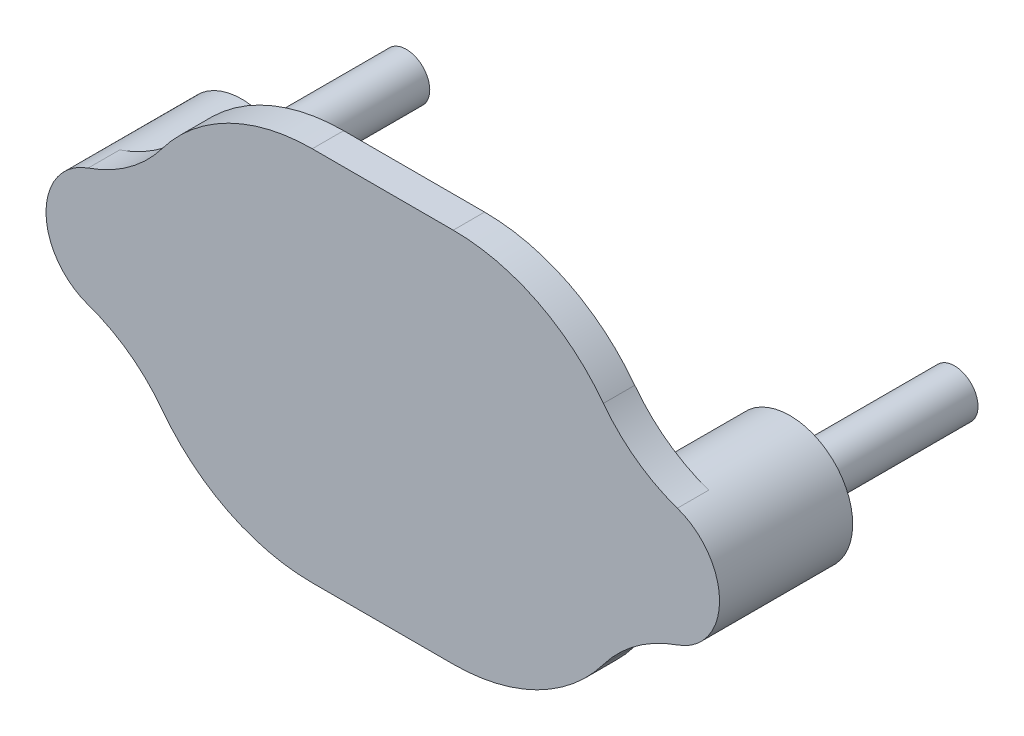
ISO-10303-21;
HEADER;
FILE_DESCRIPTION(('STEP AP214'),'2;1');
FILE_NAME('part.step','',(''),(''),'','','');
FILE_SCHEMA(('AUTOMOTIVE_DESIGN { 1 0 10303 214 1 1 1 1 }'));
ENDSEC;
DATA;
#1=APPLICATION_CONTEXT('core data for automotive mechanical design processes');
#2=APPLICATION_PROTOCOL_DEFINITION('international standard','automotive_design',2000,#1);
#3=PRODUCT_CONTEXT('',#1,'mechanical');
#4=PRODUCT('Part','Part','',(#3));
#5=PRODUCT_RELATED_PRODUCT_CATEGORY('part','',(#4));
#6=PRODUCT_DEFINITION_FORMATION('','',#4);
#7=PRODUCT_DEFINITION_CONTEXT('part definition',#1,'design');
#8=PRODUCT_DEFINITION('design','',#6,#7);
#9=PRODUCT_DEFINITION_SHAPE('','',#8);
#10=(LENGTH_UNIT() NAMED_UNIT(*) SI_UNIT(.MILLI.,.METRE.));
#11=(NAMED_UNIT(*) PLANE_ANGLE_UNIT() SI_UNIT($,.RADIAN.));
#12=(NAMED_UNIT(*) SI_UNIT($,.STERADIAN.) SOLID_ANGLE_UNIT());
#13=UNCERTAINTY_MEASURE_WITH_UNIT(LENGTH_MEASURE(1.E-05),#10,'distance_accuracy_value','');
#14=(GEOMETRIC_REPRESENTATION_CONTEXT(3) GLOBAL_UNCERTAINTY_ASSIGNED_CONTEXT((#13)) GLOBAL_UNIT_ASSIGNED_CONTEXT((#10,
#11,#12)) REPRESENTATION_CONTEXT('',''));
#15=CARTESIAN_POINT('',(0.,0.,0.));
#16=DIRECTION('',(0.,0.,1.));
#17=DIRECTION('',(1.,0.,0.));
#18=AXIS2_PLACEMENT_3D('',#15,#16,#17);
#19=CARTESIAN_POINT('',(4.5,0.,-2.));
#20=DIRECTION('',(0.,0.,1.));
#21=DIRECTION('',(1.,0.,0.));
#22=AXIS2_PLACEMENT_3D('',#19,#20,#21);
#23=CYLINDRICAL_SURFACE('',#22,12.);
#24=CARTESIAN_POINT('',(4.5,0.,0.));
#25=DIRECTION('',(0.,0.,-1.));
#26=DIRECTION('',(-1.,0.,0.));
#27=AXIS2_PLACEMENT_3D('',#24,#25,#26);
#28=CIRCLE('',#27,12.);
#29=CARTESIAN_POINT('',(4.5,12.,0.));
#30=VERTEX_POINT('',#29);
#31=CARTESIAN_POINT('',(14.0874125874126,7.21675272395575,0.));
#32=VERTEX_POINT('',#31);
#33=EDGE_CURVE('E165',#30,#32,#28,.T.);
#34=ORIENTED_EDGE('',*,*,#33,.T.);
#35=DIRECTION('',(0.,0.,1.));
#36=VECTOR('',#35,1.);
#37=CARTESIAN_POINT('',(14.0874125874126,7.21675272395575,-2.));
#38=LINE('',#37,#36);
#39=CARTESIAN_POINT('',(14.0874125874126,7.21675272395575,-2.));
#40=VERTEX_POINT('',#39);
#41=EDGE_CURVE('E236',#40,#32,#38,.T.);
#42=ORIENTED_EDGE('',*,*,#41,.F.);
#43=CARTESIAN_POINT('',(4.5,0.,-2.));
#44=DIRECTION('',(0.,0.,-1.));
#45=DIRECTION('',(-1.,0.,0.));
#46=AXIS2_PLACEMENT_3D('',#43,#44,#45);
#47=CIRCLE('',#46,12.);
#48=CARTESIAN_POINT('',(4.5,12.,-2.));
#49=VERTEX_POINT('',#48);
#50=EDGE_CURVE('E207',#49,#40,#47,.T.);
#51=ORIENTED_EDGE('',*,*,#50,.F.);
#52=DIRECTION('',(0.,0.,1.));
#53=VECTOR('',#52,1.);
#54=CARTESIAN_POINT('',(4.5,12.,-2.));
#55=LINE('',#54,#53);
#56=EDGE_CURVE('E161',#49,#30,#55,.T.);
#57=ORIENTED_EDGE('',*,*,#56,.T.);
#58=EDGE_LOOP('',(#34,#42,#51,#57));
#59=FACE_BOUND('',#58,.T.);
#60=ADVANCED_FACE('F39',(#59),#23,.T.);
#61=CARTESIAN_POINT('',(22.0769230769231,13.2307133272522,-2.));
#62=DIRECTION('',(0.,0.,1.));
#63=DIRECTION('',(1.,0.,0.));
#64=AXIS2_PLACEMENT_3D('',#61,#62,#63);
#65=CYLINDRICAL_SURFACE('',#64,10.);
#66=CARTESIAN_POINT('',(22.0769230769231,13.2307133272522,0.));
#67=DIRECTION('',(0.,0.,1.));
#68=DIRECTION('',(1.,0.,0.));
#69=AXIS2_PLACEMENT_3D('',#66,#67,#68);
#70=CIRCLE('',#69,10.);
#71=CARTESIAN_POINT('',(18.8076923076923,3.78020380778634,0.));
#72=VERTEX_POINT('',#71);
#73=EDGE_CURVE('E169',#32,#72,#70,.T.);
#74=ORIENTED_EDGE('',*,*,#73,.T.);
#75=DIRECTION('',(0.,0.,1.));
#76=VECTOR('',#75,1.);
#77=CARTESIAN_POINT('',(18.8076923076923,3.78020380778634,-2.));
#78=LINE('',#77,#76);
#79=CARTESIAN_POINT('',(18.8076923076923,3.78020380778634,-2.));
#80=VERTEX_POINT('',#79);
#81=EDGE_CURVE('E234',#80,#72,#78,.T.);
#82=ORIENTED_EDGE('',*,*,#81,.F.);
#83=CARTESIAN_POINT('',(22.0769230769231,13.2307133272522,-2.));
#84=DIRECTION('',(0.,0.,1.));
#85=DIRECTION('',(1.,0.,0.));
#86=AXIS2_PLACEMENT_3D('',#83,#84,#85);
#87=CIRCLE('',#86,10.);
#88=EDGE_CURVE('E111',#40,#80,#87,.T.);
#89=ORIENTED_EDGE('',*,*,#88,.F.);
#90=ORIENTED_EDGE('',*,*,#41,.T.);
#91=EDGE_LOOP('',(#74,#82,#89,#90));
#92=FACE_BOUND('',#91,.T.);
#93=ADVANCED_FACE('F297',(#92),#65,.F.);
#94=CARTESIAN_POINT('',(17.5,0.,-2.));
#95=DIRECTION('',(0.,0.,1.));
#96=DIRECTION('',(1.,0.,0.));
#97=AXIS2_PLACEMENT_3D('',#94,#95,#96);
#98=CYLINDRICAL_SURFACE('',#97,4.);
#99=CARTESIAN_POINT('',(17.5,0.,0.));
#100=DIRECTION('',(0.,0.,1.));
#101=DIRECTION('',(1.,0.,0.));
#102=AXIS2_PLACEMENT_3D('',#99,#100,#101);
#103=CIRCLE('',#102,4.);
#104=CARTESIAN_POINT('',(18.8076923076923,-3.78020380778634,0.));
#105=VERTEX_POINT('',#104);
#106=EDGE_CURVE('E174',#105,#72,#103,.T.);
#107=ORIENTED_EDGE('',*,*,#106,.F.);
#108=DIRECTION('',(0.,0.,1.));
#109=VECTOR('',#108,1.);
#110=CARTESIAN_POINT('',(18.8076923076923,-3.78020380778634,-2.));
#111=LINE('',#110,#109);
#112=CARTESIAN_POINT('',(18.8076923076923,-3.78020380778634,-2.));
#113=VERTEX_POINT('',#112);
#114=EDGE_CURVE('E231',#113,#105,#111,.T.);
#115=ORIENTED_EDGE('',*,*,#114,.F.);
#116=CARTESIAN_POINT('',(17.5,0.,-2.));
#117=DIRECTION('',(0.,0.,-1.));
#118=DIRECTION('',(-1.,0.,0.));
#119=AXIS2_PLACEMENT_3D('',#116,#117,#118);
#120=CIRCLE('',#119,4.);
#121=EDGE_CURVE('E42',#80,#113,#120,.F.);
#122=ORIENTED_EDGE('',*,*,#121,.F.);
#123=ORIENTED_EDGE('',*,*,#81,.T.);
#124=EDGE_LOOP('',(#107,#115,#122,#123));
#125=FACE_BOUND('',#124,.T.);
#126=CARTESIAN_POINT('',(17.5,0.,-8.5));
#127=DIRECTION('',(0.,0.,-1.));
#128=DIRECTION('',(-1.,0.,0.));
#129=AXIS2_PLACEMENT_3D('',#126,#127,#128);
#130=CIRCLE('',#129,4.);
#131=CARTESIAN_POINT('',(13.5,0.,-8.5));
#132=VERTEX_POINT('',#131);
#133=EDGE_CURVE('E251',#132,#132,#130,.T.);
#134=ORIENTED_EDGE('',*,*,#133,.F.);
#135=EDGE_LOOP('',(#134));
#136=FACE_BOUND('',#135,.T.);
#137=ADVANCED_FACE('F294',(#125,#136),#98,.T.);
#138=CARTESIAN_POINT('',(22.0769230769231,-13.2307133272522,-2.));
#139=DIRECTION('',(0.,0.,1.));
#140=DIRECTION('',(1.,0.,0.));
#141=AXIS2_PLACEMENT_3D('',#138,#139,#140);
#142=CYLINDRICAL_SURFACE('',#141,10.);
#143=CARTESIAN_POINT('',(22.0769230769231,-13.2307133272522,0.));
#144=DIRECTION('',(0.,0.,-1.));
#145=DIRECTION('',(-1.,0.,0.));
#146=AXIS2_PLACEMENT_3D('',#143,#144,#145);
#147=CIRCLE('',#146,10.);
#148=CARTESIAN_POINT('',(14.0874125874126,-7.21675272395575,0.));
#149=VERTEX_POINT('',#148);
#150=EDGE_CURVE('E178',#149,#105,#147,.T.);
#151=ORIENTED_EDGE('',*,*,#150,.F.);
#152=DIRECTION('',(0.,0.,1.));
#153=VECTOR('',#152,1.);
#154=CARTESIAN_POINT('',(14.0874125874126,-7.21675272395575,-2.));
#155=LINE('',#154,#153);
#156=CARTESIAN_POINT('',(14.0874125874126,-7.21675272395575,-2.));
#157=VERTEX_POINT('',#156);
#158=EDGE_CURVE('E228',#157,#149,#155,.T.);
#159=ORIENTED_EDGE('',*,*,#158,.F.);
#160=CARTESIAN_POINT('',(22.0769230769231,-13.2307133272522,-2.));
#161=DIRECTION('',(0.,0.,-1.));
#162=DIRECTION('',(-1.,0.,0.));
#163=AXIS2_PLACEMENT_3D('',#160,#161,#162);
#164=CIRCLE('',#163,10.);
#165=EDGE_CURVE('E264',#157,#113,#164,.T.);
#166=ORIENTED_EDGE('',*,*,#165,.T.);
#167=ORIENTED_EDGE('',*,*,#114,.T.);
#168=EDGE_LOOP('',(#151,#159,#166,#167));
#169=FACE_BOUND('',#168,.T.);
#170=ADVANCED_FACE('F304',(#169),#142,.F.);
#171=CARTESIAN_POINT('',(4.5,0.,-2.));
#172=DIRECTION('',(0.,0.,1.));
#173=DIRECTION('',(1.,0.,0.));
#174=AXIS2_PLACEMENT_3D('',#171,#172,#173);
#175=CYLINDRICAL_SURFACE('',#174,12.);
#176=CARTESIAN_POINT('',(4.5,0.,0.));
#177=DIRECTION('',(0.,0.,1.));
#178=DIRECTION('',(1.,0.,0.));
#179=AXIS2_PLACEMENT_3D('',#176,#177,#178);
#180=CIRCLE('',#179,12.);
#181=CARTESIAN_POINT('',(4.5,-12.,0.));
#182=VERTEX_POINT('',#181);
#183=EDGE_CURVE('E182',#182,#149,#180,.T.);
#184=ORIENTED_EDGE('',*,*,#183,.F.);
#185=DIRECTION('',(0.,0.,1.));
#186=VECTOR('',#185,1.);
#187=CARTESIAN_POINT('',(4.5,-12.,-2.));
#188=LINE('',#187,#186);
#189=CARTESIAN_POINT('',(4.5,-12.,-2.));
#190=VERTEX_POINT('',#189);
#191=EDGE_CURVE('E225',#190,#182,#188,.T.);
#192=ORIENTED_EDGE('',*,*,#191,.F.);
#193=CARTESIAN_POINT('',(4.5,0.,-2.));
#194=DIRECTION('',(0.,0.,1.));
#195=DIRECTION('',(1.,0.,0.));
#196=AXIS2_PLACEMENT_3D('',#193,#194,#195);
#197=CIRCLE('',#196,12.);
#198=EDGE_CURVE('E268',#190,#157,#197,.T.);
#199=ORIENTED_EDGE('',*,*,#198,.T.);
#200=ORIENTED_EDGE('',*,*,#158,.T.);
#201=EDGE_LOOP('',(#184,#192,#199,#200));
#202=FACE_BOUND('',#201,.T.);
#203=ADVANCED_FACE('F307',(#202),#175,.T.);
#204=CARTESIAN_POINT('',(-4.5,-12.,-2.));
#205=DIRECTION('',(0.,-1.,0.));
#206=DIRECTION('',(0.,0.,-1.));
#207=AXIS2_PLACEMENT_3D('',#204,#205,#206);
#208=PLANE('',#207);
#209=DIRECTION('',(1.,0.,0.));
#210=VECTOR('',#209,1.);
#211=CARTESIAN_POINT('',(-4.5,-12.,0.));
#212=LINE('',#211,#210);
#213=CARTESIAN_POINT('',(-4.5,-12.,0.));
#214=VERTEX_POINT('',#213);
#215=EDGE_CURVE('E186',#214,#182,#212,.T.);
#216=ORIENTED_EDGE('',*,*,#215,.F.);
#217=DIRECTION('',(0.,0.,1.));
#218=VECTOR('',#217,1.);
#219=CARTESIAN_POINT('',(-4.5,-12.,-2.));
#220=LINE('',#219,#218);
#221=CARTESIAN_POINT('',(-4.5,-12.,-2.));
#222=VERTEX_POINT('',#221);
#223=EDGE_CURVE('E222',#222,#214,#220,.T.);
#224=ORIENTED_EDGE('',*,*,#223,.F.);
#225=DIRECTION('',(1.,0.,0.));
#226=VECTOR('',#225,1.);
#227=CARTESIAN_POINT('',(-4.5,-12.,-2.));
#228=LINE('',#227,#226);
#229=EDGE_CURVE('E272',#222,#190,#228,.T.);
#230=ORIENTED_EDGE('',*,*,#229,.T.);
#231=ORIENTED_EDGE('',*,*,#191,.T.);
#232=EDGE_LOOP('',(#216,#224,#230,#231));
#233=FACE_BOUND('',#232,.T.);
#234=ADVANCED_FACE('F310',(#233),#208,.T.);
#235=CARTESIAN_POINT('',(-4.5,0.,-2.));
#236=DIRECTION('',(0.,0.,1.));
#237=DIRECTION('',(1.,0.,0.));
#238=AXIS2_PLACEMENT_3D('',#235,#236,#237);
#239=CYLINDRICAL_SURFACE('',#238,12.);
#240=CARTESIAN_POINT('',(-4.5,0.,0.));
#241=DIRECTION('',(0.,0.,-1.));
#242=DIRECTION('',(-1.,0.,0.));
#243=AXIS2_PLACEMENT_3D('',#240,#241,#242);
#244=CIRCLE('',#243,12.);
#245=CARTESIAN_POINT('',(-14.0874125874126,-7.21675272395575,0.));
#246=VERTEX_POINT('',#245);
#247=EDGE_CURVE('E190',#214,#246,#244,.T.);
#248=ORIENTED_EDGE('',*,*,#247,.T.);
#249=DIRECTION('',(0.,0.,1.));
#250=VECTOR('',#249,1.);
#251=CARTESIAN_POINT('',(-14.0874125874126,-7.21675272395575,-2.));
#252=LINE('',#251,#250);
#253=CARTESIAN_POINT('',(-14.0874125874126,-7.21675272395575,-2.));
#254=VERTEX_POINT('',#253);
#255=EDGE_CURVE('E218',#254,#246,#252,.T.);
#256=ORIENTED_EDGE('',*,*,#255,.F.);
#257=CARTESIAN_POINT('',(-4.5,0.,-2.));
#258=DIRECTION('',(0.,0.,-1.));
#259=DIRECTION('',(-1.,0.,0.));
#260=AXIS2_PLACEMENT_3D('',#257,#258,#259);
#261=CIRCLE('',#260,12.);
#262=EDGE_CURVE('E276',#222,#254,#261,.T.);
#263=ORIENTED_EDGE('',*,*,#262,.F.);
#264=ORIENTED_EDGE('',*,*,#223,.T.);
#265=EDGE_LOOP('',(#248,#256,#263,#264));
#266=FACE_BOUND('',#265,.T.);
#267=ADVANCED_FACE('F313',(#266),#239,.T.);
#268=CARTESIAN_POINT('',(-22.0769230769231,-13.2307133272522,-2.));
#269=DIRECTION('',(0.,0.,1.));
#270=DIRECTION('',(1.,0.,0.));
#271=AXIS2_PLACEMENT_3D('',#268,#269,#270);
#272=CYLINDRICAL_SURFACE('',#271,10.);
#273=CARTESIAN_POINT('',(-22.0769230769231,-13.2307133272522,0.));
#274=DIRECTION('',(0.,0.,1.));
#275=DIRECTION('',(1.,0.,0.));
#276=AXIS2_PLACEMENT_3D('',#273,#274,#275);
#277=CIRCLE('',#276,10.);
#278=CARTESIAN_POINT('',(-18.8076923076923,-3.78020380778635,0.));
#279=VERTEX_POINT('',#278);
#280=EDGE_CURVE('E193',#246,#279,#277,.T.);
#281=ORIENTED_EDGE('',*,*,#280,.T.);
#282=DIRECTION('',(0.,0.,1.));
#283=VECTOR('',#282,1.);
#284=CARTESIAN_POINT('',(-18.8076923076923,-3.78020380778635,-2.));
#285=LINE('',#284,#283);
#286=CARTESIAN_POINT('',(-18.8076923076923,-3.78020380778635,-2.));
#287=VERTEX_POINT('',#286);
#288=EDGE_CURVE('E214',#287,#279,#285,.T.);
#289=ORIENTED_EDGE('',*,*,#288,.F.);
#290=CARTESIAN_POINT('',(-22.0769230769231,-13.2307133272522,-2.));
#291=DIRECTION('',(0.,0.,1.));
#292=DIRECTION('',(1.,0.,0.));
#293=AXIS2_PLACEMENT_3D('',#290,#291,#292);
#294=CIRCLE('',#293,10.);
#295=EDGE_CURVE('E155',#254,#287,#294,.T.);
#296=ORIENTED_EDGE('',*,*,#295,.F.);
#297=ORIENTED_EDGE('',*,*,#255,.T.);
#298=EDGE_LOOP('',(#281,#289,#296,#297));
#299=FACE_BOUND('',#298,.T.);
#300=ADVANCED_FACE('F285',(#299),#272,.F.);
#301=CARTESIAN_POINT('',(-17.5,0.,-2.));
#302=DIRECTION('',(0.,0.,1.));
#303=DIRECTION('',(1.,0.,0.));
#304=AXIS2_PLACEMENT_3D('',#301,#302,#303);
#305=CYLINDRICAL_SURFACE('',#304,4.);
#306=CARTESIAN_POINT('',(-17.5,0.,0.));
#307=DIRECTION('',(0.,0.,-1.));
#308=DIRECTION('',(-1.,0.,0.));
#309=AXIS2_PLACEMENT_3D('',#306,#307,#308);
#310=CIRCLE('',#309,4.);
#311=CARTESIAN_POINT('',(-18.8076923076923,3.78020380778634,0.));
#312=VERTEX_POINT('',#311);
#313=EDGE_CURVE('E196',#279,#312,#310,.T.);
#314=ORIENTED_EDGE('',*,*,#313,.T.);
#315=DIRECTION('',(0.,0.,1.));
#316=VECTOR('',#315,1.);
#317=CARTESIAN_POINT('',(-18.8076923076923,3.78020380778634,-2.));
#318=LINE('',#317,#316);
#319=CARTESIAN_POINT('',(-18.8076923076923,3.78020380778634,-2.));
#320=VERTEX_POINT('',#319);
#321=EDGE_CURVE('E147',#320,#312,#318,.T.);
#322=ORIENTED_EDGE('',*,*,#321,.F.);
#323=CARTESIAN_POINT('',(-17.5,0.,-2.));
#324=DIRECTION('',(0.,0.,-1.));
#325=DIRECTION('',(-1.,0.,0.));
#326=AXIS2_PLACEMENT_3D('',#323,#324,#325);
#327=CIRCLE('',#326,4.);
#328=EDGE_CURVE('E153',#320,#287,#327,.T.);
#329=ORIENTED_EDGE('',*,*,#328,.T.);
#330=ORIENTED_EDGE('',*,*,#288,.T.);
#331=EDGE_LOOP('',(#314,#322,#329,#330));
#332=FACE_BOUND('',#331,.T.);
#333=CARTESIAN_POINT('',(-17.5,0.,-8.5));
#334=DIRECTION('',(0.,0.,-1.));
#335=DIRECTION('',(-1.,0.,0.));
#336=AXIS2_PLACEMENT_3D('',#333,#334,#335);
#337=CIRCLE('',#336,4.);
#338=CARTESIAN_POINT('',(-21.5,0.,-8.5));
#339=VERTEX_POINT('',#338);
#340=EDGE_CURVE('E170',#339,#339,#337,.T.);
#341=ORIENTED_EDGE('',*,*,#340,.F.);
#342=EDGE_LOOP('',(#341));
#343=FACE_BOUND('',#342,.T.);
#344=ADVANCED_FACE('F289',(#332,#343),#305,.T.);
#345=CARTESIAN_POINT('',(-22.0769230769231,13.2307133272522,-2.));
#346=DIRECTION('',(0.,0.,1.));
#347=DIRECTION('',(1.,0.,0.));
#348=AXIS2_PLACEMENT_3D('',#345,#346,#347);
#349=CYLINDRICAL_SURFACE('',#348,10.);
#350=CARTESIAN_POINT('',(-22.0769230769231,13.2307133272522,0.));
#351=DIRECTION('',(0.,0.,-1.));
#352=DIRECTION('',(-1.,0.,0.));
#353=AXIS2_PLACEMENT_3D('',#350,#351,#352);
#354=CIRCLE('',#353,10.);
#355=CARTESIAN_POINT('',(-14.0874125874126,7.21675272395575,0.));
#356=VERTEX_POINT('',#355);
#357=EDGE_CURVE('E141',#356,#312,#354,.T.);
#358=ORIENTED_EDGE('',*,*,#357,.F.);
#359=DIRECTION('',(0.,0.,1.));
#360=VECTOR('',#359,1.);
#361=CARTESIAN_POINT('',(-14.0874125874126,7.21675272395575,-2.));
#362=LINE('',#361,#360);
#363=CARTESIAN_POINT('',(-14.0874125874126,7.21675272395575,-2.));
#364=VERTEX_POINT('',#363);
#365=EDGE_CURVE('E135',#364,#356,#362,.T.);
#366=ORIENTED_EDGE('',*,*,#365,.F.);
#367=CARTESIAN_POINT('',(-22.0769230769231,13.2307133272522,-2.));
#368=DIRECTION('',(0.,0.,-1.));
#369=DIRECTION('',(-1.,0.,0.));
#370=AXIS2_PLACEMENT_3D('',#367,#368,#369);
#371=CIRCLE('',#370,10.);
#372=EDGE_CURVE('E138',#364,#320,#371,.T.);
#373=ORIENTED_EDGE('',*,*,#372,.T.);
#374=ORIENTED_EDGE('',*,*,#321,.T.);
#375=EDGE_LOOP('',(#358,#366,#373,#374));
#376=FACE_BOUND('',#375,.T.);
#377=ADVANCED_FACE('F137',(#376),#349,.F.);
#378=CARTESIAN_POINT('',(-4.5,0.,-2.));
#379=DIRECTION('',(0.,0.,1.));
#380=DIRECTION('',(1.,0.,0.));
#381=AXIS2_PLACEMENT_3D('',#378,#379,#380);
#382=CYLINDRICAL_SURFACE('',#381,12.);
#383=CARTESIAN_POINT('',(-4.5,0.,0.));
#384=DIRECTION('',(0.,0.,1.));
#385=DIRECTION('',(1.,0.,0.));
#386=AXIS2_PLACEMENT_3D('',#383,#384,#385);
#387=CIRCLE('',#386,12.);
#388=CARTESIAN_POINT('',(-4.5,12.,0.));
#389=VERTEX_POINT('',#388);
#390=EDGE_CURVE('E202',#389,#356,#387,.T.);
#391=ORIENTED_EDGE('',*,*,#390,.F.);
#392=DIRECTION('',(0.,0.,1.));
#393=VECTOR('',#392,1.);
#394=CARTESIAN_POINT('',(-4.5,12.,-2.));
#395=LINE('',#394,#393);
#396=CARTESIAN_POINT('',(-4.5,12.,-2.));
#397=VERTEX_POINT('',#396);
#398=EDGE_CURVE('E99',#397,#389,#395,.T.);
#399=ORIENTED_EDGE('',*,*,#398,.F.);
#400=CARTESIAN_POINT('',(-4.5,0.,-2.));
#401=DIRECTION('',(0.,0.,1.));
#402=DIRECTION('',(1.,0.,0.));
#403=AXIS2_PLACEMENT_3D('',#400,#401,#402);
#404=CIRCLE('',#403,12.);
#405=EDGE_CURVE('E151',#397,#364,#404,.T.);
#406=ORIENTED_EDGE('',*,*,#405,.T.);
#407=ORIENTED_EDGE('',*,*,#365,.T.);
#408=EDGE_LOOP('',(#391,#399,#406,#407));
#409=FACE_BOUND('',#408,.T.);
#410=ADVANCED_FACE('F157',(#409),#382,.T.);
#411=CARTESIAN_POINT('',(-4.5,12.,-2.));
#412=DIRECTION('',(0.,-1.,0.));
#413=DIRECTION('',(0.,0.,-1.));
#414=AXIS2_PLACEMENT_3D('',#411,#412,#413);
#415=PLANE('',#414);
#416=DIRECTION('',(1.,0.,0.));
#417=VECTOR('',#416,1.);
#418=CARTESIAN_POINT('',(-4.5,12.,0.));
#419=LINE('',#418,#417);
#420=EDGE_CURVE('E102',#389,#30,#419,.T.);
#421=ORIENTED_EDGE('',*,*,#420,.T.);
#422=ORIENTED_EDGE('',*,*,#56,.F.);
#423=DIRECTION('',(1.,0.,0.));
#424=VECTOR('',#423,1.);
#425=CARTESIAN_POINT('',(-4.5,12.,-2.));
#426=LINE('',#425,#424);
#427=EDGE_CURVE('E58',#397,#49,#426,.T.);
#428=ORIENTED_EDGE('',*,*,#427,.F.);
#429=ORIENTED_EDGE('',*,*,#398,.T.);
#430=EDGE_LOOP('',(#421,#422,#428,#429));
#431=FACE_BOUND('',#430,.T.);
#432=ADVANCED_FACE('F315',(#431),#415,.F.);
#433=CARTESIAN_POINT('',(4.5,0.,-2.));
#434=DIRECTION('',(0.,0.,-1.));
#435=DIRECTION('',(-1.,0.,0.));
#436=AXIS2_PLACEMENT_3D('',#433,#434,#435);
#437=PLANE('',#436);
#438=ORIENTED_EDGE('',*,*,#88,.T.);
#439=ORIENTED_EDGE('',*,*,#121,.T.);
#440=ORIENTED_EDGE('',*,*,#165,.F.);
#441=ORIENTED_EDGE('',*,*,#198,.F.);
#442=ORIENTED_EDGE('',*,*,#229,.F.);
#443=ORIENTED_EDGE('',*,*,#262,.T.);
#444=ORIENTED_EDGE('',*,*,#295,.T.);
#445=ORIENTED_EDGE('',*,*,#328,.F.);
#446=ORIENTED_EDGE('',*,*,#372,.F.);
#447=ORIENTED_EDGE('',*,*,#405,.F.);
#448=ORIENTED_EDGE('',*,*,#427,.T.);
#449=ORIENTED_EDGE('',*,*,#50,.T.);
#450=EDGE_LOOP('',(#438,#439,#440,#441,#442,#443,#444,#445,#446,#447,#448,#449));
#451=FACE_BOUND('',#450,.T.);
#452=ADVANCED_FACE('F150',(#451),#437,.T.);
#453=CARTESIAN_POINT('',(4.5,0.,0.));
#454=DIRECTION('',(0.,0.,-1.));
#455=DIRECTION('',(-1.,0.,0.));
#456=AXIS2_PLACEMENT_3D('',#453,#454,#455);
#457=PLANE('',#456);
#458=ORIENTED_EDGE('',*,*,#33,.F.);
#459=ORIENTED_EDGE('',*,*,#420,.F.);
#460=ORIENTED_EDGE('',*,*,#390,.T.);
#461=ORIENTED_EDGE('',*,*,#357,.T.);
#462=ORIENTED_EDGE('',*,*,#313,.F.);
#463=ORIENTED_EDGE('',*,*,#280,.F.);
#464=ORIENTED_EDGE('',*,*,#247,.F.);
#465=ORIENTED_EDGE('',*,*,#215,.T.);
#466=ORIENTED_EDGE('',*,*,#183,.T.);
#467=ORIENTED_EDGE('',*,*,#150,.T.);
#468=ORIENTED_EDGE('',*,*,#106,.T.);
#469=ORIENTED_EDGE('',*,*,#73,.F.);
#470=EDGE_LOOP('',(#458,#459,#460,#461,#462,#463,#464,#465,#466,#467,#468,#469));
#471=FACE_BOUND('',#470,.T.);
#472=ADVANCED_FACE('F300',(#471),#457,.F.);
#473=CARTESIAN_POINT('',(-17.5,0.,-8.5));
#474=DIRECTION('',(0.,0.,-1.));
#475=DIRECTION('',(-1.,0.,0.));
#476=AXIS2_PLACEMENT_3D('',#473,#474,#475);
#477=PLANE('',#476);
#478=CARTESIAN_POINT('',(-17.5,0.,-8.5));
#479=DIRECTION('',(0.,0.,-1.));
#480=DIRECTION('',(-1.,0.,0.));
#481=AXIS2_PLACEMENT_3D('',#478,#479,#480);
#482=CIRCLE('',#481,1.5);
#483=CARTESIAN_POINT('',(-16.,0.,-8.5));
#484=VERTEX_POINT('',#483);
#485=EDGE_CURVE('E49',#484,#484,#482,.T.);
#486=ORIENTED_EDGE('',*,*,#485,.F.);
#487=EDGE_LOOP('',(#486));
#488=FACE_BOUND('',#487,.T.);
#489=ORIENTED_EDGE('',*,*,#340,.T.);
#490=EDGE_LOOP('',(#489));
#491=FACE_BOUND('',#490,.T.);
#492=ADVANCED_FACE('F369',(#488,#491),#477,.T.);
#493=CARTESIAN_POINT('',(17.5,0.,-8.5));
#494=DIRECTION('',(0.,0.,-1.));
#495=DIRECTION('',(-1.,0.,0.));
#496=AXIS2_PLACEMENT_3D('',#493,#494,#495);
#497=PLANE('',#496);
#498=CARTESIAN_POINT('',(17.5,0.,-8.5));
#499=DIRECTION('',(0.,0.,-1.));
#500=DIRECTION('',(-1.,0.,0.));
#501=AXIS2_PLACEMENT_3D('',#498,#499,#500);
#502=CIRCLE('',#501,1.5);
#503=CARTESIAN_POINT('',(19.,0.,-8.5));
#504=VERTEX_POINT('',#503);
#505=EDGE_CURVE('E11',#504,#504,#502,.T.);
#506=ORIENTED_EDGE('',*,*,#505,.F.);
#507=EDGE_LOOP('',(#506));
#508=FACE_BOUND('',#507,.T.);
#509=ORIENTED_EDGE('',*,*,#133,.T.);
#510=EDGE_LOOP('',(#509));
#511=FACE_BOUND('',#510,.T.);
#512=ADVANCED_FACE('F414',(#508,#511),#497,.T.);
#513=CARTESIAN_POINT('',(-17.5,0.,-19.));
#514=DIRECTION('',(0.,0.,1.));
#515=DIRECTION('',(1.,0.,0.));
#516=AXIS2_PLACEMENT_3D('',#513,#514,#515);
#517=CYLINDRICAL_SURFACE('',#516,1.5);
#518=CARTESIAN_POINT('',(-17.5,0.,-19.));
#519=DIRECTION('',(0.,0.,-1.));
#520=DIRECTION('',(-1.,0.,0.));
#521=AXIS2_PLACEMENT_3D('',#518,#519,#520);
#522=CIRCLE('',#521,1.5);
#523=CARTESIAN_POINT('',(-16.,0.,-19.));
#524=VERTEX_POINT('',#523);
#525=EDGE_CURVE('E250',#524,#524,#522,.T.);
#526=CARTESIAN_POINT('',(-16.,0.,-19.));
#527=CARTESIAN_POINT('',(-16.,0.,-18.890625));
#528=CARTESIAN_POINT('',(-16.,0.,-18.78125));
#529=CARTESIAN_POINT('',(-16.,0.,-18.5625));
#530=CARTESIAN_POINT('',(-16.,0.,-18.453125));
#531=CARTESIAN_POINT('',(-16.,0.,-18.234375));
#532=CARTESIAN_POINT('',(-16.,0.,-18.125));
#533=CARTESIAN_POINT('',(-16.,0.,-17.90625));
#534=CARTESIAN_POINT('',(-16.,0.,-17.796875));
#535=CARTESIAN_POINT('',(-16.,0.,-17.578125));
#536=CARTESIAN_POINT('',(-16.,0.,-17.46875));
#537=CARTESIAN_POINT('',(-16.,0.,-17.25));
#538=CARTESIAN_POINT('',(-16.,0.,-17.140625));
#539=CARTESIAN_POINT('',(-16.,0.,-16.921875));
#540=CARTESIAN_POINT('',(-16.,0.,-16.8125));
#541=CARTESIAN_POINT('',(-16.,0.,-16.59375));
#542=CARTESIAN_POINT('',(-16.,0.,-16.484375));
#543=CARTESIAN_POINT('',(-16.,0.,-16.265625));
#544=CARTESIAN_POINT('',(-16.,0.,-16.15625));
#545=CARTESIAN_POINT('',(-16.,0.,-15.9375));
#546=CARTESIAN_POINT('',(-16.,0.,-15.828125));
#547=CARTESIAN_POINT('',(-16.,0.,-15.609375));
#548=CARTESIAN_POINT('',(-16.,0.,-15.5));
#549=CARTESIAN_POINT('',(-16.,0.,-15.28125));
#550=CARTESIAN_POINT('',(-16.,0.,-15.171875));
#551=CARTESIAN_POINT('',(-16.,0.,-14.953125));
#552=CARTESIAN_POINT('',(-16.,0.,-14.84375));
#553=CARTESIAN_POINT('',(-16.,0.,-14.625));
#554=CARTESIAN_POINT('',(-16.,0.,-14.515625));
#555=CARTESIAN_POINT('',(-16.,0.,-14.296875));
#556=CARTESIAN_POINT('',(-16.,0.,-14.1875));
#557=CARTESIAN_POINT('',(-16.,0.,-13.96875));
#558=CARTESIAN_POINT('',(-16.,0.,-13.859375));
#559=CARTESIAN_POINT('',(-16.,0.,-13.640625));
#560=CARTESIAN_POINT('',(-16.,0.,-13.53125));
#561=CARTESIAN_POINT('',(-16.,0.,-13.3125));
#562=CARTESIAN_POINT('',(-16.,0.,-13.203125));
#563=CARTESIAN_POINT('',(-16.,0.,-12.984375));
#564=CARTESIAN_POINT('',(-16.,0.,-12.875));
#565=CARTESIAN_POINT('',(-16.,0.,-12.65625));
#566=CARTESIAN_POINT('',(-16.,0.,-12.546875));
#567=CARTESIAN_POINT('',(-16.,0.,-12.328125));
#568=CARTESIAN_POINT('',(-16.,0.,-12.21875));
#569=CARTESIAN_POINT('',(-16.,0.,-12.));
#570=CARTESIAN_POINT('',(-16.,0.,-11.890625));
#571=CARTESIAN_POINT('',(-16.,0.,-11.671875));
#572=CARTESIAN_POINT('',(-16.,0.,-11.5625));
#573=CARTESIAN_POINT('',(-16.,0.,-11.34375));
#574=CARTESIAN_POINT('',(-16.,0.,-11.234375));
#575=CARTESIAN_POINT('',(-16.,0.,-11.015625));
#576=CARTESIAN_POINT('',(-16.,0.,-10.90625));
#577=CARTESIAN_POINT('',(-16.,0.,-10.6875));
#578=CARTESIAN_POINT('',(-16.,0.,-10.578125));
#579=CARTESIAN_POINT('',(-16.,0.,-10.359375));
#580=CARTESIAN_POINT('',(-16.,0.,-10.25));
#581=CARTESIAN_POINT('',(-16.,0.,-10.03125));
#582=CARTESIAN_POINT('',(-16.,0.,-9.921875));
#583=CARTESIAN_POINT('',(-16.,0.,-9.703125));
#584=CARTESIAN_POINT('',(-16.,0.,-9.59375));
#585=CARTESIAN_POINT('',(-16.,0.,-9.375));
#586=CARTESIAN_POINT('',(-16.,0.,-9.265625));
#587=CARTESIAN_POINT('',(-16.,0.,-9.046875));
#588=CARTESIAN_POINT('',(-16.,0.,-8.9375));
#589=CARTESIAN_POINT('',(-16.,0.,-8.71875));
#590=CARTESIAN_POINT('',(-16.,0.,-8.609375));
#591=CARTESIAN_POINT('',(-16.,0.,-8.5));
#592=B_SPLINE_CURVE_WITH_KNOTS('',3,(#526,#527,#528,#529,#530,#531,#532,#533,#534,#535,#536,
#537,#538,#539,#540,#541,#542,#543,#544,#545,#546,#547,#548,#549,#550,#551,#552,#553,#554,#555,
#556,#557,#558,#559,#560,#561,#562,#563,#564,#565,#566,#567,#568,#569,#570,#571,#572,#573,#574,
#575,#576,#577,#578,#579,#580,#581,#582,#583,#584,#585,#586,#587,#588,#589,#590,#591),
.UNSPECIFIED.,.F.,.F.,(4,2,2,2,2,2,2,2,2,2,2,2,2,2,2,2,2,2,2,2,2,2,2,2,2,2,2,2,2,2,2,2,4),(0.,
0.328125000000002,0.656250000000001,0.984375000000003,1.3125,1.640625,1.96875,2.296875,2.625,
2.953125,3.28125,3.609375,3.9375,4.265625,4.59375,4.921875,5.25,5.578125,5.90625,6.234375,
6.5625,6.890625,7.21875,7.54687500000001,7.875,8.203125,8.53125,8.859375,9.1875,9.515625,
9.84375,10.171875,10.5),.UNSPECIFIED.);
#593=EDGE_CURVE('BSEAM424',#524,#484,#592,.T.);
#594=ORIENTED_EDGE('',*,*,#525,.F.);
#595=ORIENTED_EDGE('',*,*,#485,.T.);
#596=ORIENTED_EDGE('',*,*,#593,.T.);
#597=ORIENTED_EDGE('',*,*,#593,.F.);
#598=EDGE_LOOP('',(#594,#596,#595,#597));
#599=FACE_BOUND('',#598,.T.);
#600=ADVANCED_FACE('F424',(#599),#517,.T.);
#601=CARTESIAN_POINT('',(-17.5,0.,-19.));
#602=DIRECTION('',(0.,0.,-1.));
#603=DIRECTION('',(-1.,0.,0.));
#604=AXIS2_PLACEMENT_3D('',#601,#602,#603);
#605=PLANE('',#604);
#606=ORIENTED_EDGE('',*,*,#525,.T.);
#607=EDGE_LOOP('',(#606));
#608=FACE_BOUND('',#607,.T.);
#609=ADVANCED_FACE('F434',(#608),#605,.T.);
#610=CARTESIAN_POINT('',(17.5,0.,-19.));
#611=DIRECTION('',(0.,0.,1.));
#612=DIRECTION('',(1.,0.,0.));
#613=AXIS2_PLACEMENT_3D('',#610,#611,#612);
#614=CYLINDRICAL_SURFACE('',#613,1.5);
#615=CARTESIAN_POINT('',(17.5,0.,-19.));
#616=DIRECTION('',(0.,0.,-1.));
#617=DIRECTION('',(-1.,0.,0.));
#618=AXIS2_PLACEMENT_3D('',#615,#616,#617);
#619=CIRCLE('',#618,1.5);
#620=CARTESIAN_POINT('',(19.,0.,-19.));
#621=VERTEX_POINT('',#620);
#622=EDGE_CURVE('E470',#621,#621,#619,.T.);
#623=CARTESIAN_POINT('',(19.,0.,-19.));
#624=CARTESIAN_POINT('',(19.,0.,-18.890625));
#625=CARTESIAN_POINT('',(19.,0.,-18.78125));
#626=CARTESIAN_POINT('',(19.,0.,-18.5625));
#627=CARTESIAN_POINT('',(19.,0.,-18.453125));
#628=CARTESIAN_POINT('',(19.,0.,-18.234375));
#629=CARTESIAN_POINT('',(19.,0.,-18.125));
#630=CARTESIAN_POINT('',(19.,0.,-17.90625));
#631=CARTESIAN_POINT('',(19.,0.,-17.796875));
#632=CARTESIAN_POINT('',(19.,0.,-17.578125));
#633=CARTESIAN_POINT('',(19.,0.,-17.46875));
#634=CARTESIAN_POINT('',(19.,0.,-17.25));
#635=CARTESIAN_POINT('',(19.,0.,-17.140625));
#636=CARTESIAN_POINT('',(19.,0.,-16.921875));
#637=CARTESIAN_POINT('',(19.,0.,-16.8125));
#638=CARTESIAN_POINT('',(19.,0.,-16.59375));
#639=CARTESIAN_POINT('',(19.,0.,-16.484375));
#640=CARTESIAN_POINT('',(19.,0.,-16.265625));
#641=CARTESIAN_POINT('',(19.,0.,-16.15625));
#642=CARTESIAN_POINT('',(19.,0.,-15.9375));
#643=CARTESIAN_POINT('',(19.,0.,-15.828125));
#644=CARTESIAN_POINT('',(19.,0.,-15.609375));
#645=CARTESIAN_POINT('',(19.,0.,-15.5));
#646=CARTESIAN_POINT('',(19.,0.,-15.28125));
#647=CARTESIAN_POINT('',(19.,0.,-15.171875));
#648=CARTESIAN_POINT('',(19.,0.,-14.953125));
#649=CARTESIAN_POINT('',(19.,0.,-14.84375));
#650=CARTESIAN_POINT('',(19.,0.,-14.625));
#651=CARTESIAN_POINT('',(19.,0.,-14.515625));
#652=CARTESIAN_POINT('',(19.,0.,-14.296875));
#653=CARTESIAN_POINT('',(19.,0.,-14.1875));
#654=CARTESIAN_POINT('',(19.,0.,-13.96875));
#655=CARTESIAN_POINT('',(19.,0.,-13.859375));
#656=CARTESIAN_POINT('',(19.,0.,-13.640625));
#657=CARTESIAN_POINT('',(19.,0.,-13.53125));
#658=CARTESIAN_POINT('',(19.,0.,-13.3125));
#659=CARTESIAN_POINT('',(19.,0.,-13.203125));
#660=CARTESIAN_POINT('',(19.,0.,-12.984375));
#661=CARTESIAN_POINT('',(19.,0.,-12.875));
#662=CARTESIAN_POINT('',(19.,0.,-12.65625));
#663=CARTESIAN_POINT('',(19.,0.,-12.546875));
#664=CARTESIAN_POINT('',(19.,0.,-12.328125));
#665=CARTESIAN_POINT('',(19.,0.,-12.21875));
#666=CARTESIAN_POINT('',(19.,0.,-12.));
#667=CARTESIAN_POINT('',(19.,0.,-11.890625));
#668=CARTESIAN_POINT('',(19.,0.,-11.671875));
#669=CARTESIAN_POINT('',(19.,0.,-11.5625));
#670=CARTESIAN_POINT('',(19.,0.,-11.34375));
#671=CARTESIAN_POINT('',(19.,0.,-11.234375));
#672=CARTESIAN_POINT('',(19.,0.,-11.015625));
#673=CARTESIAN_POINT('',(19.,0.,-10.90625));
#674=CARTESIAN_POINT('',(19.,0.,-10.6875));
#675=CARTESIAN_POINT('',(19.,0.,-10.578125));
#676=CARTESIAN_POINT('',(19.,0.,-10.359375));
#677=CARTESIAN_POINT('',(19.,0.,-10.25));
#678=CARTESIAN_POINT('',(19.,0.,-10.03125));
#679=CARTESIAN_POINT('',(19.,0.,-9.921875));
#680=CARTESIAN_POINT('',(19.,0.,-9.703125));
#681=CARTESIAN_POINT('',(19.,0.,-9.59375));
#682=CARTESIAN_POINT('',(19.,0.,-9.375));
#683=CARTESIAN_POINT('',(19.,0.,-9.265625));
#684=CARTESIAN_POINT('',(19.,0.,-9.046875));
#685=CARTESIAN_POINT('',(19.,0.,-8.9375));
#686=CARTESIAN_POINT('',(19.,0.,-8.71875));
#687=CARTESIAN_POINT('',(19.,0.,-8.609375));
#688=CARTESIAN_POINT('',(19.,0.,-8.5));
#689=B_SPLINE_CURVE_WITH_KNOTS('',3,(#623,#624,#625,#626,#627,#628,#629,#630,#631,#632,#633,
#634,#635,#636,#637,#638,#639,#640,#641,#642,#643,#644,#645,#646,#647,#648,#649,#650,#651,#652,
#653,#654,#655,#656,#657,#658,#659,#660,#661,#662,#663,#664,#665,#666,#667,#668,#669,#670,#671,
#672,#673,#674,#675,#676,#677,#678,#679,#680,#681,#682,#683,#684,#685,#686,#687,#688),
.UNSPECIFIED.,.F.,.F.,(4,2,2,2,2,2,2,2,2,2,2,2,2,2,2,2,2,2,2,2,2,2,2,2,2,2,2,2,2,2,2,2,4),(0.,
0.328125000000002,0.656250000000001,0.984375000000003,1.3125,1.640625,1.96875,2.296875,2.625,
2.953125,3.28125,3.609375,3.9375,4.265625,4.59375,4.921875,5.25,5.578125,5.90625,6.234375,
6.5625,6.890625,7.21875,7.54687500000001,7.875,8.203125,8.53125,8.859375,9.1875,9.515625,
9.84375,10.171875,10.5),.UNSPECIFIED.);
#690=EDGE_CURVE('BSEAM444',#621,#504,#689,.T.);
#691=ORIENTED_EDGE('',*,*,#622,.F.);
#692=ORIENTED_EDGE('',*,*,#505,.T.);
#693=ORIENTED_EDGE('',*,*,#690,.T.);
#694=ORIENTED_EDGE('',*,*,#690,.F.);
#695=EDGE_LOOP('',(#691,#693,#692,#694));
#696=FACE_BOUND('',#695,.T.);
#697=ADVANCED_FACE('F444',(#696),#614,.T.);
#698=CARTESIAN_POINT('',(17.5,0.,-19.));
#699=DIRECTION('',(0.,0.,-1.));
#700=DIRECTION('',(-1.,0.,0.));
#701=AXIS2_PLACEMENT_3D('',#698,#699,#700);
#702=PLANE('',#701);
#703=ORIENTED_EDGE('',*,*,#622,.T.);
#704=EDGE_LOOP('',(#703));
#705=FACE_BOUND('',#704,.T.);
#706=ADVANCED_FACE('F454',(#705),#702,.T.);
#707=CLOSED_SHELL('',(#60,#93,#137,#170,#203,#234,#267,#300,#344,#377,#410,#432,#452,#472,#492,
#512,#600,#609,#697,#706));
#708=MANIFOLD_SOLID_BREP('B2',#707);
#709=ADVANCED_BREP_SHAPE_REPRESENTATION('',(#18,#708),#14);
#710=SHAPE_DEFINITION_REPRESENTATION(#9,#709);
ENDSEC;
END-ISO-10303-21;
